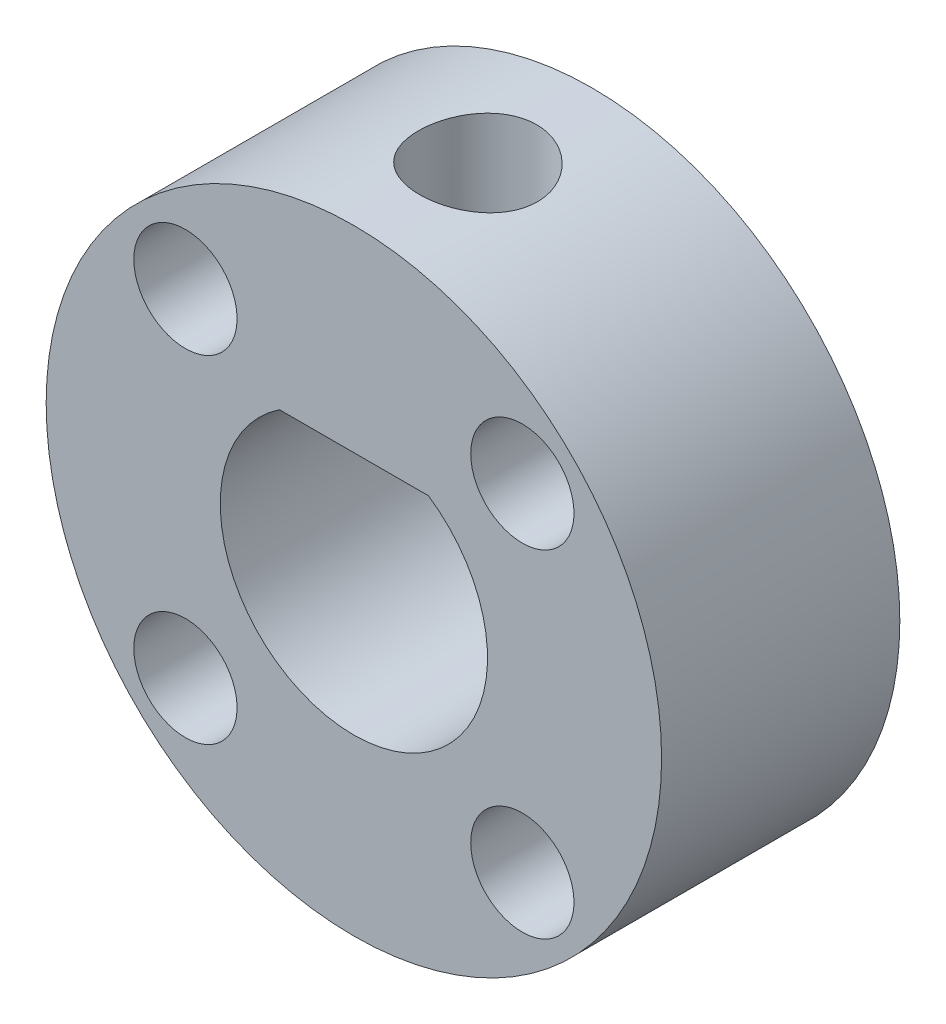
ISO-10303-21;
HEADER;
FILE_DESCRIPTION(('STEP AP214'),'2;1');
FILE_NAME('part.step','',(''),(''),'','','');
FILE_SCHEMA(('AUTOMOTIVE_DESIGN { 1 0 10303 214 1 1 1 1 }'));
ENDSEC;
DATA;
#1=APPLICATION_CONTEXT('core data for automotive mechanical design processes');
#2=APPLICATION_PROTOCOL_DEFINITION('international standard','automotive_design',2000,#1);
#3=PRODUCT_CONTEXT('',#1,'mechanical');
#4=PRODUCT('Part','Part','',(#3));
#5=PRODUCT_RELATED_PRODUCT_CATEGORY('part','',(#4));
#6=PRODUCT_DEFINITION_FORMATION('','',#4);
#7=PRODUCT_DEFINITION_CONTEXT('part definition',#1,'design');
#8=PRODUCT_DEFINITION('design','',#6,#7);
#9=PRODUCT_DEFINITION_SHAPE('','',#8);
#10=(LENGTH_UNIT() NAMED_UNIT(*) SI_UNIT(.MILLI.,.METRE.));
#11=(NAMED_UNIT(*) PLANE_ANGLE_UNIT() SI_UNIT($,.RADIAN.));
#12=(NAMED_UNIT(*) SI_UNIT($,.STERADIAN.) SOLID_ANGLE_UNIT());
#13=UNCERTAINTY_MEASURE_WITH_UNIT(LENGTH_MEASURE(1.E-05),#10,'distance_accuracy_value','');
#14=(GEOMETRIC_REPRESENTATION_CONTEXT(3) GLOBAL_UNCERTAINTY_ASSIGNED_CONTEXT((#13)) GLOBAL_UNIT_ASSIGNED_CONTEXT((#10,
#11,#12)) REPRESENTATION_CONTEXT('',''));
#15=CARTESIAN_POINT('',(0.,0.,0.));
#16=DIRECTION('',(0.,0.,1.));
#17=DIRECTION('',(1.,0.,0.));
#18=AXIS2_PLACEMENT_3D('',#15,#16,#17);
#19=CARTESIAN_POINT('',(0.,0.,0.));
#20=DIRECTION('',(0.,0.,1.));
#21=DIRECTION('',(1.,0.,0.));
#22=AXIS2_PLACEMENT_3D('',#19,#20,#21);
#23=CYLINDRICAL_SURFACE('',#22,7.75);
#24=CARTESIAN_POINT('',(0.,7.75,4.4948830706676));
#25=CARTESIAN_POINT('',(0.083027194363932,7.74999844344517,4.50175550519211));
#26=CARTESIAN_POINT('',(0.166668199163522,7.74865198131837,4.5016970672175));
#27=CARTESIAN_POINT('',(0.332739228794477,7.74330051804861,4.48771517732352));
#28=CARTESIAN_POINT('',(0.415168246968878,7.73929342188642,4.47378079497347));
#29=CARTESIAN_POINT('',(0.576368274420455,7.72895972218962,4.43251175838964));
#30=CARTESIAN_POINT('',(0.655142462808342,7.72263517875318,4.40518899852018));
#31=CARTESIAN_POINT('',(0.806947781696894,7.70825242100139,4.33798023469009));
#32=CARTESIAN_POINT('',(0.879979273215831,7.70019431578667,4.29809502126637));
#33=CARTESIAN_POINT('',(1.01916866084838,7.68301854377592,4.20636926042816));
#34=CARTESIAN_POINT('',(1.0852392707219,7.67388990311978,4.15439833578025));
#35=CARTESIAN_POINT('',(1.20779349764488,7.65555890392328,4.04017318351826));
#36=CARTESIAN_POINT('',(1.26427612758061,7.64635653789465,3.97791789839612));
#37=CARTESIAN_POINT('',(1.36674548142054,7.62871223051726,3.84395800392633));
#38=CARTESIAN_POINT('',(1.41259493111661,7.620281003845,3.77214683353967));
#39=CARTESIAN_POINT('',(1.49155110713207,7.60522180541902,3.62165530215301));
#40=CARTESIAN_POINT('',(1.52465878733762,7.59859369868937,3.54297545590343));
#41=CARTESIAN_POINT('',(1.57682404686881,7.58793994764862,3.38183207737374));
#42=CARTESIAN_POINT('',(1.59602536674386,7.583887733203,3.29941689315102));
#43=CARTESIAN_POINT('',(1.62031283526439,7.57873633368971,3.13244590929291));
#44=CARTESIAN_POINT('',(1.62540091389884,7.57763674485048,3.04789040394298));
#45=CARTESIAN_POINT('',(1.62133609789164,7.57850718650751,2.88075967816642));
#46=CARTESIAN_POINT('',(1.61245292930473,7.58041907901861,2.79817744366874));
#47=CARTESIAN_POINT('',(1.58123471033157,7.58699201440801,2.63571277660183));
#48=CARTESIAN_POINT('',(1.55889950937371,7.5916530880585,2.55583037426301));
#49=CARTESIAN_POINT('',(1.5014425550728,7.60322455008465,2.40090613917776));
#50=CARTESIAN_POINT('',(1.46630945464909,7.61013693397564,2.32586867184838));
#51=CARTESIAN_POINT('',(1.38427857612699,7.62548408658513,2.18269707001186));
#52=CARTESIAN_POINT('',(1.33737941716897,7.63391903395842,2.11456374709072));
#53=CARTESIAN_POINT('',(1.23207605889745,7.65162640346624,1.98572025874439));
#54=CARTESIAN_POINT('',(1.17346598774248,7.66091191514913,1.92518008318821));
#55=CARTESIAN_POINT('',(1.0469273917559,7.67922671659984,1.81472527315396));
#56=CARTESIAN_POINT('',(0.978998232743682,7.68825598887959,1.76481136240263));
#57=CARTESIAN_POINT('',(0.834944441510369,7.70523654215876,1.67657088173367));
#58=CARTESIAN_POINT('',(0.758747178634779,7.71317660333992,1.63836054095829));
#59=CARTESIAN_POINT('',(0.600830250594781,7.72708081734034,1.57533846445144));
#60=CARTESIAN_POINT('',(0.519111094087909,7.7330451518587,1.5505254964888));
#61=CARTESIAN_POINT('',(0.353578593678914,7.74236805498851,1.51532291379825));
#62=CARTESIAN_POINT('',(0.26980565388437,7.74575912292094,1.50475205573944));
#63=CARTESIAN_POINT('',(0.101610683160184,7.74979023504388,1.49780472641472));
#64=CARTESIAN_POINT('',(0.017188715276581,7.75043054314113,1.50142689341213));
#65=CARTESIAN_POINT('',(-0.148590347528129,7.74901251112105,1.52260763243019));
#66=CARTESIAN_POINT('',(-0.229974290577551,7.74699387559124,1.53995965092144));
#67=CARTESIAN_POINT('',(-0.388678731630204,7.74065502407477,1.58782319479167));
#68=CARTESIAN_POINT('',(-0.465999110878348,7.73633474086496,1.61833510452051));
#69=CARTESIAN_POINT('',(-0.614788940133753,7.72593861583118,1.69179041715332));
#70=CARTESIAN_POINT('',(-0.686230642769569,7.719855000181,1.73478886983792));
#71=CARTESIAN_POINT('',(-0.820965477191293,7.70669224343401,1.83195351981417));
#72=CARTESIAN_POINT('',(-0.884257793126621,7.69961300281149,1.88612083383181));
#73=CARTESIAN_POINT('',(-1.00191116292288,7.68519663847104,2.00506554470096));
#74=CARTESIAN_POINT('',(-1.05612065874422,7.67785722596628,2.06999267291482));
#75=CARTESIAN_POINT('',(-1.15290971448222,7.66392183693759,2.20807816598305));
#76=CARTESIAN_POINT('',(-1.19548910196986,7.65732587143692,2.2812366528536));
#77=CARTESIAN_POINT('',(-1.26787848685079,7.6456744933118,2.43395397085326));
#78=CARTESIAN_POINT('',(-1.29765810065501,7.64062275442297,2.51352750431628));
#79=CARTESIAN_POINT('',(-1.34338925953345,7.63271574299592,2.67665642863302));
#80=CARTESIAN_POINT('',(-1.35934220828596,7.62986024749913,2.76021141438228));
#81=CARTESIAN_POINT('',(-1.37679667616629,7.626729934808,2.92771160139335));
#82=CARTESIAN_POINT('',(-1.37849215923376,7.62642048155253,3.01163597006382));
#83=CARTESIAN_POINT('',(-1.3678872902271,7.62832959631341,3.17856343173698));
#84=CARTESIAN_POINT('',(-1.35558745914331,7.630548070225,3.26156655891771));
#85=CARTESIAN_POINT('',(-1.31750597346847,7.6372144241469,3.4237339231313));
#86=CARTESIAN_POINT('',(-1.29181474198683,7.64164734324391,3.50292006326212));
#87=CARTESIAN_POINT('',(-1.22776597725072,7.6521982493336,3.65586934813438));
#88=CARTESIAN_POINT('',(-1.18940778343577,7.65831632420152,3.72963220981579));
#89=CARTESIAN_POINT('',(-1.10060407880709,7.6715840593779,3.87055594985172));
#90=CARTESIAN_POINT('',(-1.05002685356365,7.67874459743139,3.93763278807041));
#91=CARTESIAN_POINT('',(-0.938399347749172,7.69318310336082,4.0624304894413));
#92=CARTESIAN_POINT('',(-0.877346580190866,7.70046109874962,4.12014912452919));
#93=CARTESIAN_POINT('',(-0.74570070139278,7.71432783691666,4.22521546990668));
#94=CARTESIAN_POINT('',(-0.675009952787622,7.72090810888757,4.27244200107024));
#95=CARTESIAN_POINT('',(-0.526610950896928,7.73244451280457,4.35430537012379));
#96=CARTESIAN_POINT('',(-0.448909031521059,7.7374020923217,4.3889534320395));
#97=CARTESIAN_POINT('',(-0.309349462134019,7.74405328813202,4.4374841355104));
#98=CARTESIAN_POINT('',(-0.248557003066385,7.74625844903365,4.45441563599762));
#99=CARTESIAN_POINT('',(-0.125293469687102,7.74923237327596,4.48051498202183));
#100=CARTESIAN_POINT('',(-0.0628224435153967,7.75000117776566,4.48968304996309));
#101=CARTESIAN_POINT('',(0.,7.75,4.4948830706676));
#102=B_SPLINE_CURVE_WITH_KNOTS('',3,(#24,#25,#26,#27,#28,#29,#30,#31,#32,#33,#34,#35,#36,#37,
#38,#39,#40,#41,#42,#43,#44,#45,#46,#47,#48,#49,#50,#51,#52,#53,#54,#55,#56,#57,#58,#59,#60,#61,
#62,#63,#64,#65,#66,#67,#68,#69,#70,#71,#72,#73,#74,#75,#76,#77,#78,#79,#80,#81,#82,#83,#84,#85,
#86,#87,#88,#89,#90,#91,#92,#93,#94,#95,#96,#97,#98,#99,#100,#101),.UNSPECIFIED.,.T.,.F.,(4,2,2,
2,2,2,2,2,2,2,2,2,2,2,2,2,2,2,2,2,2,2,2,2,2,2,2,2,2,2,2,2,2,2,2,2,2,2,4),(0.,0.249703461872131,
0.499603777167088,0.749282480024543,0.998945474102637,1.25143812855699,1.50395676220646,
1.75957349807702,2.01517109400639,2.26808750629915,2.52096933050907,2.76902867942907,
3.01709080498451,3.26537340887576,3.51368516474988,3.76682250301569,4.01997707628338,
4.27556981432984,4.53113904007917,4.78342419347049,5.0356851421887,5.28422158629269,
5.53276528968296,5.7824218367298,6.03210335796674,6.28560715746303,6.53911471522553,
6.7932207595328,7.04730100405907,7.29791895703853,7.5485275808054,7.79746552399667,
8.04641645092738,8.29818109367038,8.55000559049939,8.80460264443695,9.05897195454127,
9.24791524201305,9.43685311651596),.UNSPECIFIED.);
#103=CARTESIAN_POINT('',(0.,7.75,4.4948830706676));
#104=VERTEX_POINT('',#103);
#105=EDGE_CURVE('E11',#104,#104,#102,.T.);
#106=ORIENTED_EDGE('',*,*,#105,.F.);
#107=EDGE_LOOP('',(#106));
#108=FACE_BOUND('',#107,.T.);
#109=CARTESIAN_POINT('',(0.,0.,0.));
#110=DIRECTION('',(0.,0.,1.));
#111=DIRECTION('',(1.,0.,0.));
#112=AXIS2_PLACEMENT_3D('',#109,#110,#111);
#113=CIRCLE('',#112,7.75);
#114=CARTESIAN_POINT('',(7.75,0.,0.));
#115=VERTEX_POINT('',#114);
#116=EDGE_CURVE('E46',#115,#115,#113,.T.);
#117=ORIENTED_EDGE('',*,*,#116,.T.);
#118=EDGE_LOOP('',(#117));
#119=FACE_BOUND('',#118,.T.);
#120=CARTESIAN_POINT('',(0.,0.,6.));
#121=DIRECTION('',(0.,0.,1.));
#122=DIRECTION('',(1.,0.,0.));
#123=AXIS2_PLACEMENT_3D('',#120,#121,#122);
#124=CIRCLE('',#123,7.75);
#125=CARTESIAN_POINT('',(7.75,0.,6.));
#126=VERTEX_POINT('',#125);
#127=EDGE_CURVE('E69',#126,#126,#124,.T.);
#128=ORIENTED_EDGE('',*,*,#127,.F.);
#129=EDGE_LOOP('',(#128));
#130=FACE_BOUND('',#129,.T.);
#131=ADVANCED_FACE('F34',(#108,#119,#130),#23,.T.);
#132=CARTESIAN_POINT('',(7.75,0.,0.));
#133=DIRECTION('',(0.,0.,-1.));
#134=DIRECTION('',(-1.,0.,0.));
#135=AXIS2_PLACEMENT_3D('',#132,#133,#134);
#136=PLANE('',#135);
#137=CARTESIAN_POINT('',(4.24264068711929,-4.24264068711929,0.));
#138=DIRECTION('',(0.,0.,-1.));
#139=DIRECTION('',(-1.,0.,0.));
#140=AXIS2_PLACEMENT_3D('',#137,#138,#139);
#141=CIRCLE('',#140,1.29999999999999);
#142=CARTESIAN_POINT('',(2.9426406871193,-4.24264068711929,0.));
#143=VERTEX_POINT('',#142);
#144=EDGE_CURVE('E138',#143,#143,#141,.T.);
#145=ORIENTED_EDGE('',*,*,#144,.F.);
#146=EDGE_LOOP('',(#145));
#147=FACE_BOUND('',#146,.T.);
#148=CARTESIAN_POINT('',(-4.24264068711929,4.24264068711929,0.));
#149=DIRECTION('',(0.,0.,-1.));
#150=DIRECTION('',(-1.,0.,0.));
#151=AXIS2_PLACEMENT_3D('',#148,#149,#150);
#152=CIRCLE('',#151,1.29999999999999);
#153=CARTESIAN_POINT('',(-5.54264068711928,4.24264068711929,0.));
#154=VERTEX_POINT('',#153);
#155=EDGE_CURVE('E140',#154,#154,#152,.T.);
#156=ORIENTED_EDGE('',*,*,#155,.F.);
#157=EDGE_LOOP('',(#156));
#158=FACE_BOUND('',#157,.T.);
#159=CARTESIAN_POINT('',(4.24264068711929,4.24264068711929,0.));
#160=DIRECTION('',(0.,0.,-1.));
#161=DIRECTION('',(-1.,0.,0.));
#162=AXIS2_PLACEMENT_3D('',#159,#160,#161);
#163=CIRCLE('',#162,1.29999999999999);
#164=CARTESIAN_POINT('',(2.9426406871193,4.24264068711929,0.));
#165=VERTEX_POINT('',#164);
#166=EDGE_CURVE('E148',#165,#165,#163,.T.);
#167=ORIENTED_EDGE('',*,*,#166,.F.);
#168=EDGE_LOOP('',(#167));
#169=FACE_BOUND('',#168,.T.);
#170=CARTESIAN_POINT('',(-4.24264068711929,-4.24264068711929,0.));
#171=DIRECTION('',(0.,0.,-1.));
#172=DIRECTION('',(-1.,0.,0.));
#173=AXIS2_PLACEMENT_3D('',#170,#171,#172);
#174=CIRCLE('',#173,1.29999999999999);
#175=CARTESIAN_POINT('',(-5.54264068711928,-4.24264068711929,0.));
#176=VERTEX_POINT('',#175);
#177=EDGE_CURVE('E154',#176,#176,#174,.T.);
#178=ORIENTED_EDGE('',*,*,#177,.F.);
#179=EDGE_LOOP('',(#178));
#180=FACE_BOUND('',#179,.T.);
#181=CARTESIAN_POINT('',(0.,0.,0.));
#182=DIRECTION('',(0.,0.,-1.));
#183=DIRECTION('',(-1.,0.,0.));
#184=AXIS2_PLACEMENT_3D('',#181,#182,#183);
#185=CIRCLE('',#184,3.3655);
#186=CARTESIAN_POINT('',(1.87620741124216,2.794,0.));
#187=VERTEX_POINT('',#186);
#188=CARTESIAN_POINT('',(-1.87620741124216,2.794,0.));
#189=VERTEX_POINT('',#188);
#190=EDGE_CURVE('E53',#187,#189,#185,.T.);
#191=ORIENTED_EDGE('',*,*,#190,.F.);
#192=DIRECTION('',(1.,0.,0.));
#193=VECTOR('',#192,1.);
#194=CARTESIAN_POINT('',(-1.87620741124216,2.794,0.));
#195=LINE('',#194,#193);
#196=EDGE_CURVE('E73',#189,#187,#195,.T.);
#197=ORIENTED_EDGE('',*,*,#196,.F.);
#198=EDGE_LOOP('',(#191,#197));
#199=FACE_BOUND('',#198,.T.);
#200=ORIENTED_EDGE('',*,*,#116,.F.);
#201=EDGE_LOOP('',(#200));
#202=FACE_BOUND('',#201,.T.);
#203=ADVANCED_FACE('F77',(#147,#158,#169,#180,#199,#202),#136,.T.);
#204=CARTESIAN_POINT('',(0.,0.,6.));
#205=DIRECTION('',(0.,0.,1.));
#206=DIRECTION('',(1.,0.,0.));
#207=AXIS2_PLACEMENT_3D('',#204,#205,#206);
#208=PLANE('',#207);
#209=CARTESIAN_POINT('',(4.24264068711929,-4.24264068711929,6.00000000000001));
#210=DIRECTION('',(0.,0.,-1.));
#211=DIRECTION('',(-1.,0.,0.));
#212=AXIS2_PLACEMENT_3D('',#209,#210,#211);
#213=CIRCLE('',#212,1.29999999999999);
#214=CARTESIAN_POINT('',(2.9426406871193,-4.24264068711929,6.00000000000001));
#215=VERTEX_POINT('',#214);
#216=EDGE_CURVE('E136',#215,#215,#213,.T.);
#217=ORIENTED_EDGE('',*,*,#216,.T.);
#218=EDGE_LOOP('',(#217));
#219=FACE_BOUND('',#218,.T.);
#220=CARTESIAN_POINT('',(-4.24264068711929,4.24264068711929,6.00000000000001));
#221=DIRECTION('',(0.,0.,-1.));
#222=DIRECTION('',(-1.,0.,0.));
#223=AXIS2_PLACEMENT_3D('',#220,#221,#222);
#224=CIRCLE('',#223,1.29999999999999);
#225=CARTESIAN_POINT('',(-5.54264068711928,4.24264068711929,6.00000000000001));
#226=VERTEX_POINT('',#225);
#227=EDGE_CURVE('E145',#226,#226,#224,.T.);
#228=ORIENTED_EDGE('',*,*,#227,.T.);
#229=EDGE_LOOP('',(#228));
#230=FACE_BOUND('',#229,.T.);
#231=CARTESIAN_POINT('',(4.24264068711929,4.24264068711929,6.00000000000001));
#232=DIRECTION('',(0.,0.,-1.));
#233=DIRECTION('',(-1.,0.,0.));
#234=AXIS2_PLACEMENT_3D('',#231,#232,#233);
#235=CIRCLE('',#234,1.29999999999999);
#236=CARTESIAN_POINT('',(2.9426406871193,4.24264068711929,6.00000000000001));
#237=VERTEX_POINT('',#236);
#238=EDGE_CURVE('E151',#237,#237,#235,.T.);
#239=ORIENTED_EDGE('',*,*,#238,.T.);
#240=EDGE_LOOP('',(#239));
#241=FACE_BOUND('',#240,.T.);
#242=CARTESIAN_POINT('',(-4.24264068711929,-4.24264068711929,6.00000000000001));
#243=DIRECTION('',(0.,0.,-1.));
#244=DIRECTION('',(-1.,0.,0.));
#245=AXIS2_PLACEMENT_3D('',#242,#243,#244);
#246=CIRCLE('',#245,1.29999999999999);
#247=CARTESIAN_POINT('',(-5.54264068711928,-4.24264068711929,6.00000000000001));
#248=VERTEX_POINT('',#247);
#249=EDGE_CURVE('E82',#248,#248,#246,.T.);
#250=ORIENTED_EDGE('',*,*,#249,.T.);
#251=EDGE_LOOP('',(#250));
#252=FACE_BOUND('',#251,.T.);
#253=CARTESIAN_POINT('',(0.,0.,6.));
#254=DIRECTION('',(0.,0.,-1.));
#255=DIRECTION('',(-1.,0.,0.));
#256=AXIS2_PLACEMENT_3D('',#253,#254,#255);
#257=CIRCLE('',#256,3.3655);
#258=CARTESIAN_POINT('',(1.87620741124216,2.794,6.));
#259=VERTEX_POINT('',#258);
#260=CARTESIAN_POINT('',(-1.87620741124216,2.794,6.));
#261=VERTEX_POINT('',#260);
#262=EDGE_CURVE('E58',#259,#261,#257,.T.);
#263=ORIENTED_EDGE('',*,*,#262,.T.);
#264=DIRECTION('',(1.,0.,0.));
#265=VECTOR('',#264,1.);
#266=CARTESIAN_POINT('',(-1.87620741124216,2.794,6.));
#267=LINE('',#266,#265);
#268=EDGE_CURVE('E85',#261,#259,#267,.T.);
#269=ORIENTED_EDGE('',*,*,#268,.T.);
#270=EDGE_LOOP('',(#263,#269));
#271=FACE_BOUND('',#270,.T.);
#272=ORIENTED_EDGE('',*,*,#127,.T.);
#273=EDGE_LOOP('',(#272));
#274=FACE_BOUND('',#273,.T.);
#275=ADVANCED_FACE('F95',(#219,#230,#241,#252,#271,#274),#208,.T.);
#276=CARTESIAN_POINT('',(0.,0.,6.));
#277=DIRECTION('',(0.,0.,-1.));
#278=DIRECTION('',(-1.,0.,0.));
#279=AXIS2_PLACEMENT_3D('',#276,#277,#278);
#280=CYLINDRICAL_SURFACE('',#279,3.3655);
#281=ORIENTED_EDGE('',*,*,#190,.T.);
#282=DIRECTION('',(0.,0.,-1.));
#283=VECTOR('',#282,1.);
#284=CARTESIAN_POINT('',(-1.87620741124216,2.794,6.));
#285=LINE('',#284,#283);
#286=EDGE_CURVE('E70',#261,#189,#285,.T.);
#287=ORIENTED_EDGE('',*,*,#286,.F.);
#288=ORIENTED_EDGE('',*,*,#262,.F.);
#289=DIRECTION('',(0.,0.,-1.));
#290=VECTOR('',#289,1.);
#291=CARTESIAN_POINT('',(1.87620741124216,2.794,6.));
#292=LINE('',#291,#290);
#293=EDGE_CURVE('E63',#259,#187,#292,.T.);
#294=ORIENTED_EDGE('',*,*,#293,.T.);
#295=EDGE_LOOP('',(#281,#287,#288,#294));
#296=FACE_BOUND('',#295,.T.);
#297=ADVANCED_FACE('F65',(#296),#280,.F.);
#298=CARTESIAN_POINT('',(-1.87620741124216,2.794,6.));
#299=DIRECTION('',(0.,1.,0.));
#300=DIRECTION('',(0.,0.,1.));
#301=AXIS2_PLACEMENT_3D('',#298,#299,#300);
#302=PLANE('',#301);
#303=CARTESIAN_POINT('',(0.123792588757841,2.794,3.));
#304=DIRECTION('',(0.,-1.,0.));
#305=DIRECTION('',(0.,0.,-1.));
#306=AXIS2_PLACEMENT_3D('',#303,#304,#305);
#307=CIRCLE('',#306,1.49999999999999);
#308=CARTESIAN_POINT('',(0.123792588757841,2.794,1.50000000000001));
#309=VERTEX_POINT('',#308);
#310=EDGE_CURVE('E79',#309,#309,#307,.T.);
#311=ORIENTED_EDGE('',*,*,#310,.F.);
#312=EDGE_LOOP('',(#311));
#313=FACE_BOUND('',#312,.T.);
#314=ORIENTED_EDGE('',*,*,#196,.T.);
#315=ORIENTED_EDGE('',*,*,#293,.F.);
#316=ORIENTED_EDGE('',*,*,#268,.F.);
#317=ORIENTED_EDGE('',*,*,#286,.T.);
#318=EDGE_LOOP('',(#314,#315,#316,#317));
#319=FACE_BOUND('',#318,.T.);
#320=ADVANCED_FACE('F74',(#313,#319),#302,.F.);
#321=CARTESIAN_POINT('',(0.123792588757841,2.794,3.));
#322=DIRECTION('',(0.,-1.,0.));
#323=DIRECTION('',(0.,0.,-1.));
#324=AXIS2_PLACEMENT_3D('',#321,#322,#323);
#325=CYLINDRICAL_SURFACE('',#324,1.49999999999999);
#326=ORIENTED_EDGE('',*,*,#105,.T.);
#327=EDGE_LOOP('',(#326));
#328=FACE_BOUND('',#327,.T.);
#329=ORIENTED_EDGE('',*,*,#310,.T.);
#330=EDGE_LOOP('',(#329));
#331=FACE_BOUND('',#330,.T.);
#332=ADVANCED_FACE('F110',(#328,#331),#325,.F.);
#333=CARTESIAN_POINT('',(-4.24264068711929,-4.24264068711929,0.));
#334=DIRECTION('',(0.,0.,-1.));
#335=DIRECTION('',(-1.,0.,0.));
#336=AXIS2_PLACEMENT_3D('',#333,#334,#335);
#337=CYLINDRICAL_SURFACE('',#336,1.29999999999999);
#338=ORIENTED_EDGE('',*,*,#249,.F.);
#339=EDGE_LOOP('',(#338));
#340=FACE_BOUND('',#339,.T.);
#341=ORIENTED_EDGE('',*,*,#177,.T.);
#342=EDGE_LOOP('',(#341));
#343=FACE_BOUND('',#342,.T.);
#344=ADVANCED_FACE('F115',(#340,#343),#337,.F.);
#345=CARTESIAN_POINT('',(4.24264068711929,4.24264068711929,0.));
#346=DIRECTION('',(0.,0.,-1.));
#347=DIRECTION('',(-1.,0.,0.));
#348=AXIS2_PLACEMENT_3D('',#345,#346,#347);
#349=CYLINDRICAL_SURFACE('',#348,1.29999999999999);
#350=ORIENTED_EDGE('',*,*,#238,.F.);
#351=EDGE_LOOP('',(#350));
#352=FACE_BOUND('',#351,.T.);
#353=ORIENTED_EDGE('',*,*,#166,.T.);
#354=EDGE_LOOP('',(#353));
#355=FACE_BOUND('',#354,.T.);
#356=ADVANCED_FACE('F119',(#352,#355),#349,.F.);
#357=CARTESIAN_POINT('',(-4.24264068711929,4.24264068711929,0.));
#358=DIRECTION('',(0.,0.,-1.));
#359=DIRECTION('',(-1.,0.,0.));
#360=AXIS2_PLACEMENT_3D('',#357,#358,#359);
#361=CYLINDRICAL_SURFACE('',#360,1.29999999999999);
#362=ORIENTED_EDGE('',*,*,#227,.F.);
#363=EDGE_LOOP('',(#362));
#364=FACE_BOUND('',#363,.T.);
#365=ORIENTED_EDGE('',*,*,#155,.T.);
#366=EDGE_LOOP('',(#365));
#367=FACE_BOUND('',#366,.T.);
#368=ADVANCED_FACE('F123',(#364,#367),#361,.F.);
#369=CARTESIAN_POINT('',(4.24264068711929,-4.24264068711929,0.));
#370=DIRECTION('',(0.,0.,-1.));
#371=DIRECTION('',(-1.,0.,0.));
#372=AXIS2_PLACEMENT_3D('',#369,#370,#371);
#373=CYLINDRICAL_SURFACE('',#372,1.29999999999999);
#374=ORIENTED_EDGE('',*,*,#216,.F.);
#375=EDGE_LOOP('',(#374));
#376=FACE_BOUND('',#375,.T.);
#377=ORIENTED_EDGE('',*,*,#144,.T.);
#378=EDGE_LOOP('',(#377));
#379=FACE_BOUND('',#378,.T.);
#380=ADVANCED_FACE('F127',(#376,#379),#373,.F.);
#381=CLOSED_SHELL('',(#131,#203,#275,#297,#320,#332,#344,#356,#368,#380));
#382=MANIFOLD_SOLID_BREP('B2',#381);
#383=ADVANCED_BREP_SHAPE_REPRESENTATION('',(#18,#382),#14);
#384=SHAPE_DEFINITION_REPRESENTATION(#9,#383);
ENDSEC;
END-ISO-10303-21;
